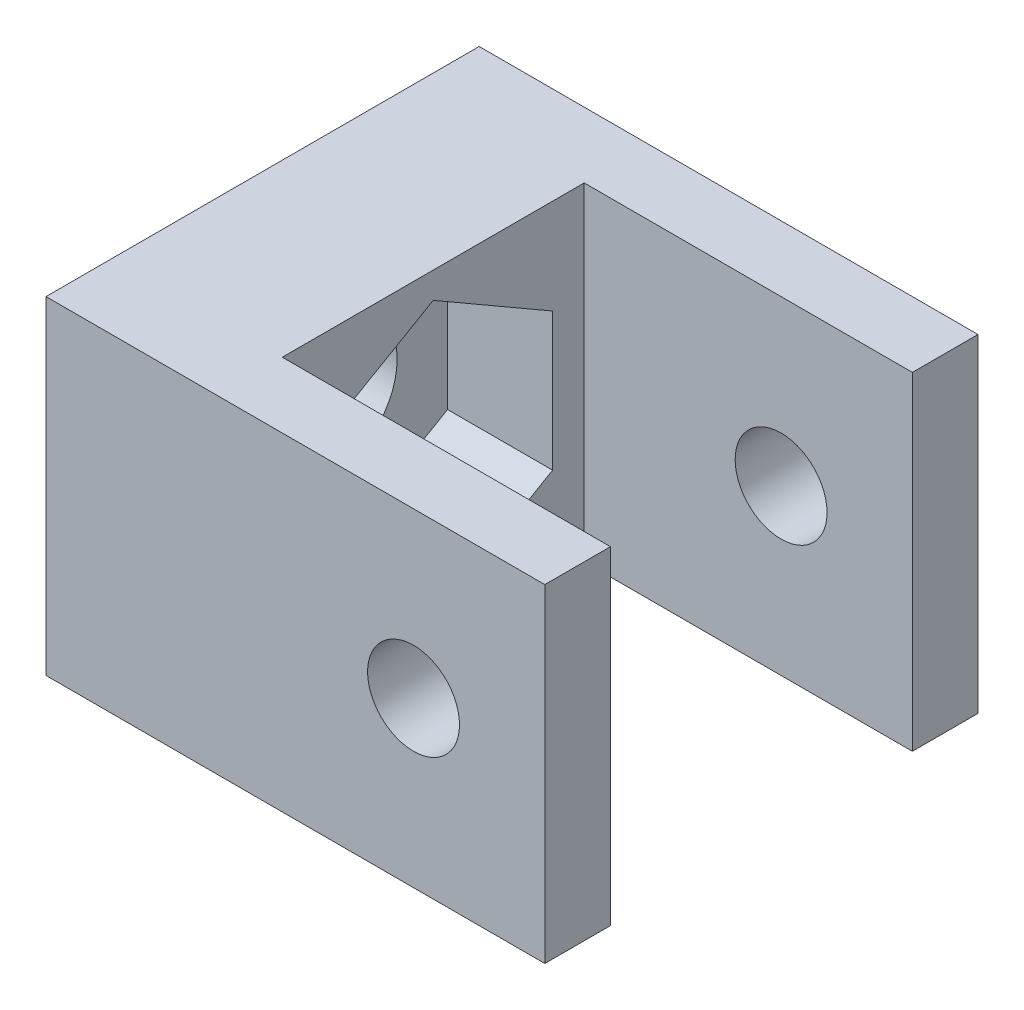
ISO-10303-21;
HEADER;
FILE_DESCRIPTION(('STEP AP214'),'2;1');
FILE_NAME('part.step','',(''),(''),'','','');
FILE_SCHEMA(('AUTOMOTIVE_DESIGN { 1 0 10303 214 1 1 1 1 }'));
ENDSEC;
DATA;
#1=APPLICATION_CONTEXT('core data for automotive mechanical design processes');
#2=APPLICATION_PROTOCOL_DEFINITION('international standard','automotive_design',2000,#1);
#3=PRODUCT_CONTEXT('',#1,'mechanical');
#4=PRODUCT('Part','Part','',(#3));
#5=PRODUCT_RELATED_PRODUCT_CATEGORY('part','',(#4));
#6=PRODUCT_DEFINITION_FORMATION('','',#4);
#7=PRODUCT_DEFINITION_CONTEXT('part definition',#1,'design');
#8=PRODUCT_DEFINITION('design','',#6,#7);
#9=PRODUCT_DEFINITION_SHAPE('','',#8);
#10=(LENGTH_UNIT() NAMED_UNIT(*) SI_UNIT(.MILLI.,.METRE.));
#11=(NAMED_UNIT(*) PLANE_ANGLE_UNIT() SI_UNIT($,.RADIAN.));
#12=(NAMED_UNIT(*) SI_UNIT($,.STERADIAN.) SOLID_ANGLE_UNIT());
#13=UNCERTAINTY_MEASURE_WITH_UNIT(LENGTH_MEASURE(1.E-05),#10,'distance_accuracy_value','');
#14=(GEOMETRIC_REPRESENTATION_CONTEXT(3) GLOBAL_UNCERTAINTY_ASSIGNED_CONTEXT((#13)) GLOBAL_UNIT_ASSIGNED_CONTEXT((#10,
#11,#12)) REPRESENTATION_CONTEXT('',''));
#15=CARTESIAN_POINT('',(0.,0.,0.));
#16=DIRECTION('',(0.,0.,1.));
#17=DIRECTION('',(1.,0.,0.));
#18=AXIS2_PLACEMENT_3D('',#15,#16,#17);
#19=CARTESIAN_POINT('',(-38.,12.5,16.5));
#20=DIRECTION('',(1.,0.,0.));
#21=DIRECTION('',(0.,0.,-1.));
#22=AXIS2_PLACEMENT_3D('',#19,#20,#21);
#23=CYLINDRICAL_SURFACE('',#22,5.25);
#24=CARTESIAN_POINT('',(-38.,12.5,16.5));
#25=DIRECTION('',(1.,0.,0.));
#26=DIRECTION('',(0.,0.,-1.));
#27=AXIS2_PLACEMENT_3D('',#24,#25,#26);
#28=CIRCLE('',#27,5.25);
#29=CARTESIAN_POINT('',(-38.,12.5,11.25));
#30=VERTEX_POINT('',#29);
#31=EDGE_CURVE('E185',#30,#30,#28,.T.);
#32=ORIENTED_EDGE('',*,*,#31,.F.);
#33=EDGE_LOOP('',(#32));
#34=FACE_BOUND('',#33,.T.);
#35=CARTESIAN_POINT('',(-33.,12.5,16.5));
#36=DIRECTION('',(1.,0.,0.));
#37=DIRECTION('',(0.,0.,-1.));
#38=AXIS2_PLACEMENT_3D('',#35,#36,#37);
#39=CIRCLE('',#38,5.25);
#40=CARTESIAN_POINT('',(-33.,12.5,11.25));
#41=VERTEX_POINT('',#40);
#42=EDGE_CURVE('E38',#41,#41,#39,.F.);
#43=ORIENTED_EDGE('',*,*,#42,.F.);
#44=EDGE_LOOP('',(#43));
#45=FACE_BOUND('',#44,.T.);
#46=ADVANCED_FACE('F34',(#34,#45),#23,.F.);
#47=CARTESIAN_POINT('',(0.,25.,5.));
#48=DIRECTION('',(-1.,0.,0.));
#49=DIRECTION('',(0.,0.,1.));
#50=AXIS2_PLACEMENT_3D('',#47,#48,#49);
#51=PLANE('',#50);
#52=DIRECTION('',(0.,0.,-1.));
#53=VECTOR('',#52,1.);
#54=CARTESIAN_POINT('',(0.,0.,5.));
#55=LINE('',#54,#53);
#56=CARTESIAN_POINT('',(0.,0.,5.));
#57=VERTEX_POINT('',#56);
#58=CARTESIAN_POINT('',(0.,0.,0.));
#59=VERTEX_POINT('',#58);
#60=EDGE_CURVE('E145',#57,#59,#55,.T.);
#61=ORIENTED_EDGE('',*,*,#60,.T.);
#62=DIRECTION('',(0.,-1.,0.));
#63=VECTOR('',#62,1.);
#64=CARTESIAN_POINT('',(0.,25.,0.));
#65=LINE('',#64,#63);
#66=CARTESIAN_POINT('',(0.,25.,0.));
#67=VERTEX_POINT('',#66);
#68=EDGE_CURVE('E11',#67,#59,#65,.T.);
#69=ORIENTED_EDGE('',*,*,#68,.F.);
#70=DIRECTION('',(0.,0.,-1.));
#71=VECTOR('',#70,1.);
#72=CARTESIAN_POINT('',(0.,25.,5.));
#73=LINE('',#72,#71);
#74=CARTESIAN_POINT('',(0.,25.,5.));
#75=VERTEX_POINT('',#74);
#76=EDGE_CURVE('E161',#75,#67,#73,.T.);
#77=ORIENTED_EDGE('',*,*,#76,.F.);
#78=DIRECTION('',(0.,-1.,0.));
#79=VECTOR('',#78,1.);
#80=CARTESIAN_POINT('',(0.,25.,5.));
#81=LINE('',#80,#79);
#82=EDGE_CURVE('E141',#75,#57,#81,.T.);
#83=ORIENTED_EDGE('',*,*,#82,.T.);
#84=EDGE_LOOP('',(#61,#69,#77,#83));
#85=FACE_BOUND('',#84,.T.);
#86=ADVANCED_FACE('F36',(#85),#51,.F.);
#87=CARTESIAN_POINT('',(0.,25.,0.));
#88=DIRECTION('',(0.,0.,1.));
#89=DIRECTION('',(1.,0.,0.));
#90=AXIS2_PLACEMENT_3D('',#87,#88,#89);
#91=PLANE('',#90);
#92=CARTESIAN_POINT('',(-10.,12.5,0.));
#93=DIRECTION('',(0.,0.,1.));
#94=DIRECTION('',(1.,0.,0.));
#95=AXIS2_PLACEMENT_3D('',#92,#93,#94);
#96=CIRCLE('',#95,3.5);
#97=CARTESIAN_POINT('',(-6.5,12.5,0.));
#98=VERTEX_POINT('',#97);
#99=EDGE_CURVE('E174',#98,#98,#96,.T.);
#100=ORIENTED_EDGE('',*,*,#99,.T.);
#101=EDGE_LOOP('',(#100));
#102=FACE_BOUND('',#101,.T.);
#103=DIRECTION('',(-1.,0.,0.));
#104=VECTOR('',#103,1.);
#105=CARTESIAN_POINT('',(0.,0.,0.));
#106=LINE('',#105,#104);
#107=CARTESIAN_POINT('',(-38.,0.,0.));
#108=VERTEX_POINT('',#107);
#109=EDGE_CURVE('E148',#59,#108,#106,.T.);
#110=ORIENTED_EDGE('',*,*,#109,.T.);
#111=DIRECTION('',(0.,-1.,0.));
#112=VECTOR('',#111,1.);
#113=CARTESIAN_POINT('',(-38.,25.,0.));
#114=LINE('',#113,#112);
#115=CARTESIAN_POINT('',(-38.,25.,0.));
#116=VERTEX_POINT('',#115);
#117=EDGE_CURVE('E43',#116,#108,#114,.T.);
#118=ORIENTED_EDGE('',*,*,#117,.F.);
#119=DIRECTION('',(-1.,0.,0.));
#120=VECTOR('',#119,1.);
#121=CARTESIAN_POINT('',(0.,25.,0.));
#122=LINE('',#121,#120);
#123=EDGE_CURVE('E101',#67,#116,#122,.T.);
#124=ORIENTED_EDGE('',*,*,#123,.F.);
#125=ORIENTED_EDGE('',*,*,#68,.T.);
#126=EDGE_LOOP('',(#110,#118,#124,#125));
#127=FACE_BOUND('',#126,.T.);
#128=ADVANCED_FACE('F212',(#102,#127),#91,.F.);
#129=CARTESIAN_POINT('',(-38.,25.,0.));
#130=DIRECTION('',(1.,0.,0.));
#131=DIRECTION('',(0.,0.,-1.));
#132=AXIS2_PLACEMENT_3D('',#129,#130,#131);
#133=PLANE('',#132);
#134=ORIENTED_EDGE('',*,*,#31,.T.);
#135=EDGE_LOOP('',(#134));
#136=FACE_BOUND('',#135,.T.);
#137=DIRECTION('',(0.,0.,1.));
#138=VECTOR('',#137,1.);
#139=CARTESIAN_POINT('',(-38.,0.,0.));
#140=LINE('',#139,#138);
#141=CARTESIAN_POINT('',(-38.,0.,33.));
#142=VERTEX_POINT('',#141);
#143=EDGE_CURVE('E151',#108,#142,#140,.T.);
#144=ORIENTED_EDGE('',*,*,#143,.T.);
#145=DIRECTION('',(0.,-1.,0.));
#146=VECTOR('',#145,1.);
#147=CARTESIAN_POINT('',(-38.,25.,33.));
#148=LINE('',#147,#146);
#149=CARTESIAN_POINT('',(-38.,25.,33.));
#150=VERTEX_POINT('',#149);
#151=EDGE_CURVE('E168',#150,#142,#148,.T.);
#152=ORIENTED_EDGE('',*,*,#151,.F.);
#153=DIRECTION('',(0.,0.,1.));
#154=VECTOR('',#153,1.);
#155=CARTESIAN_POINT('',(-38.,25.,0.));
#156=LINE('',#155,#154);
#157=EDGE_CURVE('E192',#116,#150,#156,.T.);
#158=ORIENTED_EDGE('',*,*,#157,.F.);
#159=ORIENTED_EDGE('',*,*,#117,.T.);
#160=EDGE_LOOP('',(#144,#152,#158,#159));
#161=FACE_BOUND('',#160,.T.);
#162=ADVANCED_FACE('F215',(#136,#161),#133,.F.);
#163=CARTESIAN_POINT('',(-38.,25.,33.));
#164=DIRECTION('',(0.,0.,-1.));
#165=DIRECTION('',(-1.,0.,0.));
#166=AXIS2_PLACEMENT_3D('',#163,#164,#165);
#167=PLANE('',#166);
#168=CARTESIAN_POINT('',(-10.,12.5,33.));
#169=DIRECTION('',(0.,0.,1.));
#170=DIRECTION('',(1.,0.,0.));
#171=AXIS2_PLACEMENT_3D('',#168,#169,#170);
#172=CIRCLE('',#171,3.5);
#173=CARTESIAN_POINT('',(-6.5,12.5,33.));
#174=VERTEX_POINT('',#173);
#175=EDGE_CURVE('E180',#174,#174,#172,.T.);
#176=ORIENTED_EDGE('',*,*,#175,.F.);
#177=EDGE_LOOP('',(#176));
#178=FACE_BOUND('',#177,.T.);
#179=DIRECTION('',(1.,0.,0.));
#180=VECTOR('',#179,1.);
#181=CARTESIAN_POINT('',(-38.,0.,33.));
#182=LINE('',#181,#180);
#183=CARTESIAN_POINT('',(0.,0.,33.));
#184=VERTEX_POINT('',#183);
#185=EDGE_CURVE('E153',#142,#184,#182,.T.);
#186=ORIENTED_EDGE('',*,*,#185,.T.);
#187=DIRECTION('',(0.,-1.,0.));
#188=VECTOR('',#187,1.);
#189=CARTESIAN_POINT('',(0.,25.,33.));
#190=LINE('',#189,#188);
#191=CARTESIAN_POINT('',(0.,25.,33.));
#192=VERTEX_POINT('',#191);
#193=EDGE_CURVE('E165',#192,#184,#190,.T.);
#194=ORIENTED_EDGE('',*,*,#193,.F.);
#195=DIRECTION('',(1.,0.,0.));
#196=VECTOR('',#195,1.);
#197=CARTESIAN_POINT('',(-38.,25.,33.));
#198=LINE('',#197,#196);
#199=EDGE_CURVE('E194',#150,#192,#198,.T.);
#200=ORIENTED_EDGE('',*,*,#199,.F.);
#201=ORIENTED_EDGE('',*,*,#151,.T.);
#202=EDGE_LOOP('',(#186,#194,#200,#201));
#203=FACE_BOUND('',#202,.T.);
#204=ADVANCED_FACE('F200',(#178,#203),#167,.F.);
#205=CARTESIAN_POINT('',(0.,25.,33.));
#206=DIRECTION('',(-1.,0.,0.));
#207=DIRECTION('',(0.,0.,1.));
#208=AXIS2_PLACEMENT_3D('',#205,#206,#207);
#209=PLANE('',#208);
#210=DIRECTION('',(0.,0.,-1.));
#211=VECTOR('',#210,1.);
#212=CARTESIAN_POINT('',(0.,0.,33.));
#213=LINE('',#212,#211);
#214=CARTESIAN_POINT('',(0.,0.,28.));
#215=VERTEX_POINT('',#214);
#216=EDGE_CURVE('E155',#184,#215,#213,.T.);
#217=ORIENTED_EDGE('',*,*,#216,.T.);
#218=DIRECTION('',(0.,-1.,0.));
#219=VECTOR('',#218,1.);
#220=CARTESIAN_POINT('',(0.,25.,28.));
#221=LINE('',#220,#219);
#222=CARTESIAN_POINT('',(0.,25.,28.));
#223=VERTEX_POINT('',#222);
#224=EDGE_CURVE('E136',#223,#215,#221,.T.);
#225=ORIENTED_EDGE('',*,*,#224,.F.);
#226=DIRECTION('',(0.,0.,-1.));
#227=VECTOR('',#226,1.);
#228=CARTESIAN_POINT('',(0.,25.,33.));
#229=LINE('',#228,#227);
#230=EDGE_CURVE('E124',#192,#223,#229,.T.);
#231=ORIENTED_EDGE('',*,*,#230,.F.);
#232=ORIENTED_EDGE('',*,*,#193,.T.);
#233=EDGE_LOOP('',(#217,#225,#231,#232));
#234=FACE_BOUND('',#233,.T.);
#235=ADVANCED_FACE('F204',(#234),#209,.F.);
#236=CARTESIAN_POINT('',(0.,25.,28.));
#237=DIRECTION('',(0.,0.,1.));
#238=DIRECTION('',(1.,0.,0.));
#239=AXIS2_PLACEMENT_3D('',#236,#237,#238);
#240=PLANE('',#239);
#241=CARTESIAN_POINT('',(-10.,12.5,28.));
#242=DIRECTION('',(0.,0.,1.));
#243=DIRECTION('',(1.,0.,0.));
#244=AXIS2_PLACEMENT_3D('',#241,#242,#243);
#245=CIRCLE('',#244,3.5);
#246=CARTESIAN_POINT('',(-6.5,12.5,28.));
#247=VERTEX_POINT('',#246);
#248=EDGE_CURVE('E149',#247,#247,#245,.T.);
#249=ORIENTED_EDGE('',*,*,#248,.T.);
#250=EDGE_LOOP('',(#249));
#251=FACE_BOUND('',#250,.T.);
#252=DIRECTION('',(-1.,0.,0.));
#253=VECTOR('',#252,1.);
#254=CARTESIAN_POINT('',(0.,0.,28.));
#255=LINE('',#254,#253);
#256=CARTESIAN_POINT('',(-25.,0.,28.));
#257=VERTEX_POINT('',#256);
#258=EDGE_CURVE('E133',#215,#257,#255,.T.);
#259=ORIENTED_EDGE('',*,*,#258,.T.);
#260=DIRECTION('',(0.,-1.,0.));
#261=VECTOR('',#260,1.);
#262=CARTESIAN_POINT('',(-25.,25.,28.));
#263=LINE('',#262,#261);
#264=CARTESIAN_POINT('',(-25.,25.,28.));
#265=VERTEX_POINT('',#264);
#266=EDGE_CURVE('E130',#265,#257,#263,.T.);
#267=ORIENTED_EDGE('',*,*,#266,.F.);
#268=DIRECTION('',(-1.,0.,0.));
#269=VECTOR('',#268,1.);
#270=CARTESIAN_POINT('',(0.,25.,28.));
#271=LINE('',#270,#269);
#272=EDGE_CURVE('E117',#223,#265,#271,.T.);
#273=ORIENTED_EDGE('',*,*,#272,.F.);
#274=ORIENTED_EDGE('',*,*,#224,.T.);
#275=EDGE_LOOP('',(#259,#267,#273,#274));
#276=FACE_BOUND('',#275,.T.);
#277=ADVANCED_FACE('F131',(#251,#276),#240,.F.);
#278=CARTESIAN_POINT('',(-25.,25.,28.));
#279=DIRECTION('',(-1.,0.,0.));
#280=DIRECTION('',(0.,0.,1.));
#281=AXIS2_PLACEMENT_3D('',#278,#279,#280);
#282=PLANE('',#281);
#283=DIRECTION('',(0.,0.500000000000001,0.866025403784438));
#284=VECTOR('',#283,1.);
#285=CARTESIAN_POINT('',(-25.,17.75,7.40673326026339));
#286=LINE('',#285,#284);
#287=CARTESIAN_POINT('',(-25.,17.75,7.40673326026339));
#288=VERTEX_POINT('',#287);
#289=CARTESIAN_POINT('',(-25.,23.,16.5));
#290=VERTEX_POINT('',#289);
#291=EDGE_CURVE('E402',#288,#290,#286,.T.);
#292=ORIENTED_EDGE('',*,*,#291,.F.);
#293=DIRECTION('',(0.,1.,0.));
#294=VECTOR('',#293,1.);
#295=CARTESIAN_POINT('',(-25.,7.24999999999999,7.40673326026339));
#296=LINE('',#295,#294);
#297=CARTESIAN_POINT('',(-25.,7.24999999999999,7.40673326026339));
#298=VERTEX_POINT('',#297);
#299=EDGE_CURVE('E51',#298,#288,#296,.T.);
#300=ORIENTED_EDGE('',*,*,#299,.F.);
#301=DIRECTION('',(0.,0.5,-0.866025403784439));
#302=VECTOR('',#301,1.);
#303=CARTESIAN_POINT('',(-25.,2.,16.5));
#304=LINE('',#303,#302);
#305=CARTESIAN_POINT('',(-25.,2.,16.5));
#306=VERTEX_POINT('',#305);
#307=EDGE_CURVE('E427',#306,#298,#304,.T.);
#308=ORIENTED_EDGE('',*,*,#307,.F.);
#309=DIRECTION('',(0.,-0.5,-0.866025403784439));
#310=VECTOR('',#309,1.);
#311=CARTESIAN_POINT('',(-25.,7.25,25.5932667397366));
#312=LINE('',#311,#310);
#313=CARTESIAN_POINT('',(-25.,7.25,25.5932667397366));
#314=VERTEX_POINT('',#313);
#315=EDGE_CURVE('E421',#314,#306,#312,.T.);
#316=ORIENTED_EDGE('',*,*,#315,.F.);
#317=DIRECTION('',(0.,-1.,0.));
#318=VECTOR('',#317,1.);
#319=CARTESIAN_POINT('',(-25.,17.75,25.5932667397366));
#320=LINE('',#319,#318);
#321=CARTESIAN_POINT('',(-25.,17.75,25.5932667397366));
#322=VERTEX_POINT('',#321);
#323=EDGE_CURVE('E418',#322,#314,#320,.T.);
#324=ORIENTED_EDGE('',*,*,#323,.F.);
#325=DIRECTION('',(0.,-0.499999999999999,0.866025403784439));
#326=VECTOR('',#325,1.);
#327=CARTESIAN_POINT('',(-25.,23.,16.5));
#328=LINE('',#327,#326);
#329=EDGE_CURVE('E412',#290,#322,#328,.T.);
#330=ORIENTED_EDGE('',*,*,#329,.F.);
#331=EDGE_LOOP('',(#292,#300,#308,#316,#324,#330));
#332=FACE_BOUND('',#331,.T.);
#333=DIRECTION('',(0.,0.,-1.));
#334=VECTOR('',#333,1.);
#335=CARTESIAN_POINT('',(-25.,0.,28.));
#336=LINE('',#335,#334);
#337=CARTESIAN_POINT('',(-25.,0.,5.));
#338=VERTEX_POINT('',#337);
#339=EDGE_CURVE('E158',#257,#338,#336,.T.);
#340=ORIENTED_EDGE('',*,*,#339,.T.);
#341=DIRECTION('',(0.,-1.,0.));
#342=VECTOR('',#341,1.);
#343=CARTESIAN_POINT('',(-25.,25.,5.));
#344=LINE('',#343,#342);
#345=CARTESIAN_POINT('',(-25.,25.,5.));
#346=VERTEX_POINT('',#345);
#347=EDGE_CURVE('E137',#346,#338,#344,.T.);
#348=ORIENTED_EDGE('',*,*,#347,.F.);
#349=DIRECTION('',(0.,0.,-1.));
#350=VECTOR('',#349,1.);
#351=CARTESIAN_POINT('',(-25.,25.,28.));
#352=LINE('',#351,#350);
#353=EDGE_CURVE('E121',#265,#346,#352,.T.);
#354=ORIENTED_EDGE('',*,*,#353,.F.);
#355=ORIENTED_EDGE('',*,*,#266,.T.);
#356=EDGE_LOOP('',(#340,#348,#354,#355));
#357=FACE_BOUND('',#356,.T.);
#358=ADVANCED_FACE('F139',(#332,#357),#282,.F.);
#359=CARTESIAN_POINT('',(-25.,25.,5.));
#360=DIRECTION('',(0.,0.,-1.));
#361=DIRECTION('',(-1.,0.,0.));
#362=AXIS2_PLACEMENT_3D('',#359,#360,#361);
#363=PLANE('',#362);
#364=CARTESIAN_POINT('',(-10.,12.5,5.));
#365=DIRECTION('',(0.,0.,-1.));
#366=DIRECTION('',(-1.,0.,0.));
#367=AXIS2_PLACEMENT_3D('',#364,#365,#366);
#368=CIRCLE('',#367,3.5);
#369=CARTESIAN_POINT('',(-13.5,12.5,5.));
#370=VERTEX_POINT('',#369);
#371=EDGE_CURVE('E172',#370,#370,#368,.T.);
#372=ORIENTED_EDGE('',*,*,#371,.T.);
#373=EDGE_LOOP('',(#372));
#374=FACE_BOUND('',#373,.T.);
#375=DIRECTION('',(1.,0.,0.));
#376=VECTOR('',#375,1.);
#377=CARTESIAN_POINT('',(-25.,0.,5.));
#378=LINE('',#377,#376);
#379=EDGE_CURVE('E93',#338,#57,#378,.T.);
#380=ORIENTED_EDGE('',*,*,#379,.T.);
#381=ORIENTED_EDGE('',*,*,#82,.F.);
#382=DIRECTION('',(1.,0.,0.));
#383=VECTOR('',#382,1.);
#384=CARTESIAN_POINT('',(-25.,25.,5.));
#385=LINE('',#384,#383);
#386=EDGE_CURVE('E60',#346,#75,#385,.T.);
#387=ORIENTED_EDGE('',*,*,#386,.F.);
#388=ORIENTED_EDGE('',*,*,#347,.T.);
#389=EDGE_LOOP('',(#380,#381,#387,#388));
#390=FACE_BOUND('',#389,.T.);
#391=ADVANCED_FACE('F208',(#374,#390),#363,.F.);
#392=CARTESIAN_POINT('',(0.,25.,0.));
#393=DIRECTION('',(0.,1.,0.));
#394=DIRECTION('',(0.,0.,1.));
#395=AXIS2_PLACEMENT_3D('',#392,#393,#394);
#396=PLANE('',#395);
#397=ORIENTED_EDGE('',*,*,#76,.T.);
#398=ORIENTED_EDGE('',*,*,#123,.T.);
#399=ORIENTED_EDGE('',*,*,#157,.T.);
#400=ORIENTED_EDGE('',*,*,#199,.T.);
#401=ORIENTED_EDGE('',*,*,#230,.T.);
#402=ORIENTED_EDGE('',*,*,#272,.T.);
#403=ORIENTED_EDGE('',*,*,#353,.T.);
#404=ORIENTED_EDGE('',*,*,#386,.T.);
#405=EDGE_LOOP('',(#397,#398,#399,#400,#401,#402,#403,#404));
#406=FACE_BOUND('',#405,.T.);
#407=ADVANCED_FACE('F119',(#406),#396,.T.);
#408=CARTESIAN_POINT('',(0.,0.,0.));
#409=DIRECTION('',(0.,1.,0.));
#410=DIRECTION('',(0.,0.,1.));
#411=AXIS2_PLACEMENT_3D('',#408,#409,#410);
#412=PLANE('',#411);
#413=ORIENTED_EDGE('',*,*,#60,.F.);
#414=ORIENTED_EDGE('',*,*,#379,.F.);
#415=ORIENTED_EDGE('',*,*,#339,.F.);
#416=ORIENTED_EDGE('',*,*,#258,.F.);
#417=ORIENTED_EDGE('',*,*,#216,.F.);
#418=ORIENTED_EDGE('',*,*,#185,.F.);
#419=ORIENTED_EDGE('',*,*,#143,.F.);
#420=ORIENTED_EDGE('',*,*,#109,.F.);
#421=EDGE_LOOP('',(#413,#414,#415,#416,#417,#418,#419,#420));
#422=FACE_BOUND('',#421,.T.);
#423=ADVANCED_FACE('F207',(#422),#412,.F.);
#424=CARTESIAN_POINT('',(-10.,12.5,0.));
#425=DIRECTION('',(0.,0.,1.));
#426=DIRECTION('',(1.,0.,0.));
#427=AXIS2_PLACEMENT_3D('',#424,#425,#426);
#428=CYLINDRICAL_SURFACE('',#427,3.5);
#429=ORIENTED_EDGE('',*,*,#99,.F.);
#430=EDGE_LOOP('',(#429));
#431=FACE_BOUND('',#430,.T.);
#432=ORIENTED_EDGE('',*,*,#371,.F.);
#433=EDGE_LOOP('',(#432));
#434=FACE_BOUND('',#433,.T.);
#435=ADVANCED_FACE('F242',(#431,#434),#428,.F.);
#436=ORIENTED_EDGE('',*,*,#175,.T.);
#437=EDGE_LOOP('',(#436));
#438=FACE_BOUND('',#437,.T.);
#439=ORIENTED_EDGE('',*,*,#248,.F.);
#440=EDGE_LOOP('',(#439));
#441=FACE_BOUND('',#440,.T.);
#442=ADVANCED_FACE('F238',(#438,#441),#428,.F.);
#443=CARTESIAN_POINT('',(-33.,0.,0.));
#444=DIRECTION('',(1.,0.,0.));
#445=DIRECTION('',(0.,0.,-1.));
#446=AXIS2_PLACEMENT_3D('',#443,#444,#445);
#447=PLANE('',#446);
#448=DIRECTION('',(0.,1.,0.));
#449=VECTOR('',#448,1.);
#450=CARTESIAN_POINT('',(-33.,7.24999999999999,7.40673326026339));
#451=LINE('',#450,#449);
#452=CARTESIAN_POINT('',(-33.,7.24999999999999,7.40673326026339));
#453=VERTEX_POINT('',#452);
#454=CARTESIAN_POINT('',(-33.,17.75,7.40673326026339));
#455=VERTEX_POINT('',#454);
#456=EDGE_CURVE('E430',#453,#455,#451,.T.);
#457=ORIENTED_EDGE('',*,*,#456,.T.);
#458=DIRECTION('',(0.,0.500000000000001,0.866025403784438));
#459=VECTOR('',#458,1.);
#460=CARTESIAN_POINT('',(-33.,17.75,7.40673326026339));
#461=LINE('',#460,#459);
#462=CARTESIAN_POINT('',(-33.,23.,16.5));
#463=VERTEX_POINT('',#462);
#464=EDGE_CURVE('E457',#455,#463,#461,.T.);
#465=ORIENTED_EDGE('',*,*,#464,.T.);
#466=DIRECTION('',(0.,-0.499999999999999,0.866025403784439));
#467=VECTOR('',#466,1.);
#468=CARTESIAN_POINT('',(-33.,23.,16.5));
#469=LINE('',#468,#467);
#470=CARTESIAN_POINT('',(-33.,17.75,25.5932667397366));
#471=VERTEX_POINT('',#470);
#472=EDGE_CURVE('E454',#463,#471,#469,.T.);
#473=ORIENTED_EDGE('',*,*,#472,.T.);
#474=DIRECTION('',(0.,-1.,0.));
#475=VECTOR('',#474,1.);
#476=CARTESIAN_POINT('',(-33.,17.75,25.5932667397366));
#477=LINE('',#476,#475);
#478=CARTESIAN_POINT('',(-33.,7.25,25.5932667397366));
#479=VERTEX_POINT('',#478);
#480=EDGE_CURVE('E449',#471,#479,#477,.T.);
#481=ORIENTED_EDGE('',*,*,#480,.T.);
#482=DIRECTION('',(0.,-0.5,-0.866025403784439));
#483=VECTOR('',#482,1.);
#484=CARTESIAN_POINT('',(-33.,7.25,25.5932667397366));
#485=LINE('',#484,#483);
#486=CARTESIAN_POINT('',(-33.,2.,16.5));
#487=VERTEX_POINT('',#486);
#488=EDGE_CURVE('E444',#479,#487,#485,.T.);
#489=ORIENTED_EDGE('',*,*,#488,.T.);
#490=DIRECTION('',(0.,0.5,-0.866025403784439));
#491=VECTOR('',#490,1.);
#492=CARTESIAN_POINT('',(-33.,2.,16.5));
#493=LINE('',#492,#491);
#494=EDGE_CURVE('E442',#487,#453,#493,.T.);
#495=ORIENTED_EDGE('',*,*,#494,.T.);
#496=EDGE_LOOP('',(#457,#465,#473,#481,#489,#495));
#497=FACE_BOUND('',#496,.T.);
#498=ORIENTED_EDGE('',*,*,#42,.T.);
#499=EDGE_LOOP('',(#498));
#500=FACE_BOUND('',#499,.T.);
#501=ADVANCED_FACE('F241',(#497,#500),#447,.T.);
#502=CARTESIAN_POINT('',(-33.,7.24999999999999,7.40673326026339));
#503=DIRECTION('',(0.,0.,-1.));
#504=DIRECTION('',(-1.,0.,0.));
#505=AXIS2_PLACEMENT_3D('',#502,#503,#504);
#506=PLANE('',#505);
#507=ORIENTED_EDGE('',*,*,#299,.T.);
#508=DIRECTION('',(1.,0.,0.));
#509=VECTOR('',#508,1.);
#510=CARTESIAN_POINT('',(-33.,17.75,7.40673326026339));
#511=LINE('',#510,#509);
#512=EDGE_CURVE('E409',#455,#288,#511,.T.);
#513=ORIENTED_EDGE('',*,*,#512,.F.);
#514=ORIENTED_EDGE('',*,*,#456,.F.);
#515=DIRECTION('',(1.,0.,0.));
#516=VECTOR('',#515,1.);
#517=CARTESIAN_POINT('',(-33.,7.24999999999999,7.40673326026339));
#518=LINE('',#517,#516);
#519=EDGE_CURVE('E431',#453,#298,#518,.T.);
#520=ORIENTED_EDGE('',*,*,#519,.T.);
#521=EDGE_LOOP('',(#507,#513,#514,#520));
#522=FACE_BOUND('',#521,.T.);
#523=ADVANCED_FACE('F236',(#522),#506,.F.);
#524=CARTESIAN_POINT('',(-33.,2.,16.5));
#525=DIRECTION('',(0.,-0.866025403784439,-0.5));
#526=DIRECTION('',(0.,0.5,-0.866025403784439));
#527=AXIS2_PLACEMENT_3D('',#524,#525,#526);
#528=PLANE('',#527);
#529=ORIENTED_EDGE('',*,*,#307,.T.);
#530=ORIENTED_EDGE('',*,*,#519,.F.);
#531=ORIENTED_EDGE('',*,*,#494,.F.);
#532=DIRECTION('',(1.,0.,0.));
#533=VECTOR('',#532,1.);
#534=CARTESIAN_POINT('',(-33.,2.,16.5));
#535=LINE('',#534,#533);
#536=EDGE_CURVE('E433',#487,#306,#535,.T.);
#537=ORIENTED_EDGE('',*,*,#536,.T.);
#538=EDGE_LOOP('',(#529,#530,#531,#537));
#539=FACE_BOUND('',#538,.T.);
#540=ADVANCED_FACE('F306',(#539),#528,.F.);
#541=CARTESIAN_POINT('',(-33.,7.25,25.5932667397366));
#542=DIRECTION('',(0.,-0.866025403784439,0.5));
#543=DIRECTION('',(0.,-0.5,-0.866025403784439));
#544=AXIS2_PLACEMENT_3D('',#541,#542,#543);
#545=PLANE('',#544);
#546=ORIENTED_EDGE('',*,*,#315,.T.);
#547=ORIENTED_EDGE('',*,*,#536,.F.);
#548=ORIENTED_EDGE('',*,*,#488,.F.);
#549=DIRECTION('',(1.,0.,0.));
#550=VECTOR('',#549,1.);
#551=CARTESIAN_POINT('',(-33.,7.25,25.5932667397366));
#552=LINE('',#551,#550);
#553=EDGE_CURVE('E436',#479,#314,#552,.T.);
#554=ORIENTED_EDGE('',*,*,#553,.T.);
#555=EDGE_LOOP('',(#546,#547,#548,#554));
#556=FACE_BOUND('',#555,.T.);
#557=ADVANCED_FACE('F312',(#556),#545,.F.);
#558=CARTESIAN_POINT('',(-33.,17.75,25.5932667397366));
#559=DIRECTION('',(0.,0.,1.));
#560=DIRECTION('',(1.,0.,0.));
#561=AXIS2_PLACEMENT_3D('',#558,#559,#560);
#562=PLANE('',#561);
#563=ORIENTED_EDGE('',*,*,#323,.T.);
#564=ORIENTED_EDGE('',*,*,#553,.F.);
#565=ORIENTED_EDGE('',*,*,#480,.F.);
#566=DIRECTION('',(1.,0.,0.));
#567=VECTOR('',#566,1.);
#568=CARTESIAN_POINT('',(-33.,17.75,25.5932667397366));
#569=LINE('',#568,#567);
#570=EDGE_CURVE('E439',#471,#322,#569,.T.);
#571=ORIENTED_EDGE('',*,*,#570,.T.);
#572=EDGE_LOOP('',(#563,#564,#565,#571));
#573=FACE_BOUND('',#572,.T.);
#574=ADVANCED_FACE('F320',(#573),#562,.F.);
#575=CARTESIAN_POINT('',(-33.,23.,16.5));
#576=DIRECTION('',(0.,0.866025403784439,0.499999999999999));
#577=DIRECTION('',(0.,-0.499999999999999,0.866025403784439));
#578=AXIS2_PLACEMENT_3D('',#575,#576,#577);
#579=PLANE('',#578);
#580=ORIENTED_EDGE('',*,*,#329,.T.);
#581=ORIENTED_EDGE('',*,*,#570,.F.);
#582=ORIENTED_EDGE('',*,*,#472,.F.);
#583=DIRECTION('',(1.,0.,0.));
#584=VECTOR('',#583,1.);
#585=CARTESIAN_POINT('',(-33.,23.,16.5));
#586=LINE('',#585,#584);
#587=EDGE_CURVE('E407',#463,#290,#586,.T.);
#588=ORIENTED_EDGE('',*,*,#587,.T.);
#589=EDGE_LOOP('',(#580,#581,#582,#588));
#590=FACE_BOUND('',#589,.T.);
#591=ADVANCED_FACE('F328',(#590),#579,.F.);
#592=CARTESIAN_POINT('',(-33.,17.75,7.40673326026339));
#593=DIRECTION('',(0.,0.866025403784438,-0.500000000000001));
#594=DIRECTION('',(0.,0.500000000000001,0.866025403784438));
#595=AXIS2_PLACEMENT_3D('',#592,#593,#594);
#596=PLANE('',#595);
#597=ORIENTED_EDGE('',*,*,#291,.T.);
#598=ORIENTED_EDGE('',*,*,#587,.F.);
#599=ORIENTED_EDGE('',*,*,#464,.F.);
#600=ORIENTED_EDGE('',*,*,#512,.T.);
#601=EDGE_LOOP('',(#597,#598,#599,#600));
#602=FACE_BOUND('',#601,.T.);
#603=ADVANCED_FACE('F336',(#602),#596,.F.);
#604=CLOSED_SHELL('',(#46,#86,#128,#162,#204,#235,#277,#358,#391,#407,#423,#435,#442,#501,#523,
#540,#557,#574,#591,#603));
#605=MANIFOLD_SOLID_BREP('B2',#604);
#606=ADVANCED_BREP_SHAPE_REPRESENTATION('',(#18,#605),#14);
#607=SHAPE_DEFINITION_REPRESENTATION(#9,#606);
ENDSEC;
END-ISO-10303-21;
